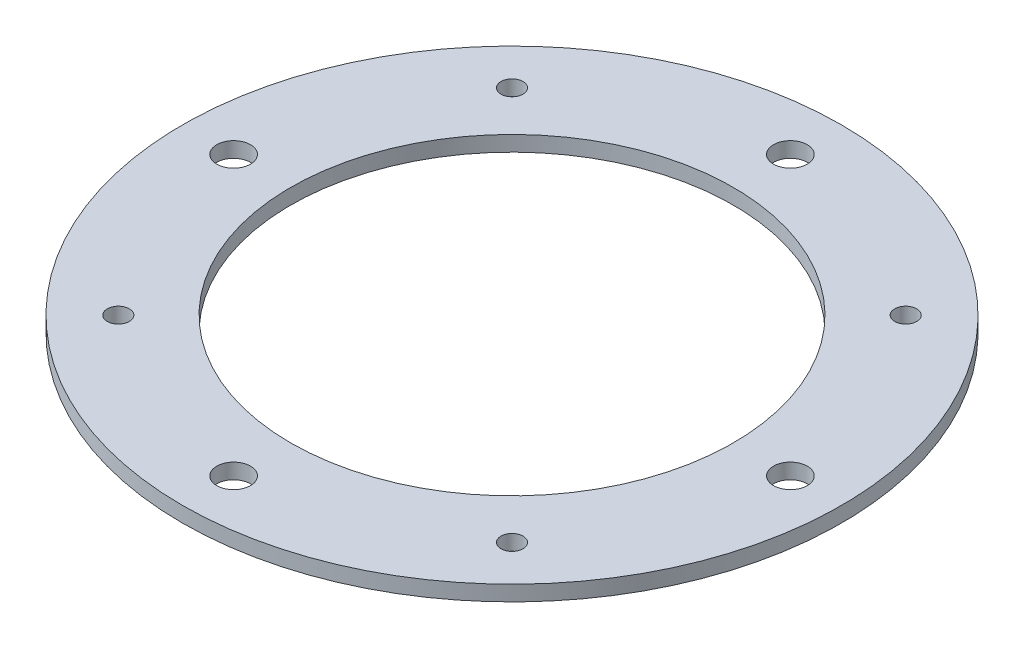
ISO-10303-21;
HEADER;
FILE_DESCRIPTION(('STEP AP214'),'2;1');
FILE_NAME('part.step','',(''),(''),'','','');
FILE_SCHEMA(('AUTOMOTIVE_DESIGN { 1 0 10303 214 1 1 1 1 }'));
ENDSEC;
DATA;
#1=APPLICATION_CONTEXT('core data for automotive mechanical design processes');
#2=APPLICATION_PROTOCOL_DEFINITION('international standard','automotive_design',2000,#1);
#3=PRODUCT_CONTEXT('',#1,'mechanical');
#4=PRODUCT('Part','Part','',(#3));
#5=PRODUCT_RELATED_PRODUCT_CATEGORY('part','',(#4));
#6=PRODUCT_DEFINITION_FORMATION('','',#4);
#7=PRODUCT_DEFINITION_CONTEXT('part definition',#1,'design');
#8=PRODUCT_DEFINITION('design','',#6,#7);
#9=PRODUCT_DEFINITION_SHAPE('','',#8);
#10=(LENGTH_UNIT() NAMED_UNIT(*) SI_UNIT(.MILLI.,.METRE.));
#11=(NAMED_UNIT(*) PLANE_ANGLE_UNIT() SI_UNIT($,.RADIAN.));
#12=(NAMED_UNIT(*) SI_UNIT($,.STERADIAN.) SOLID_ANGLE_UNIT());
#13=UNCERTAINTY_MEASURE_WITH_UNIT(LENGTH_MEASURE(1.E-05),#10,'distance_accuracy_value','');
#14=(GEOMETRIC_REPRESENTATION_CONTEXT(3) GLOBAL_UNCERTAINTY_ASSIGNED_CONTEXT((#13)) GLOBAL_UNIT_ASSIGNED_CONTEXT((#10,
#11,#12)) REPRESENTATION_CONTEXT('',''));
#15=CARTESIAN_POINT('',(0.,0.,0.));
#16=DIRECTION('',(0.,0.,1.));
#17=DIRECTION('',(1.,0.,0.));
#18=AXIS2_PLACEMENT_3D('',#15,#16,#17);
#19=CARTESIAN_POINT('',(0.,1.5,0.));
#20=DIRECTION('',(0.,-1.,0.));
#21=DIRECTION('',(0.,0.,-1.));
#22=AXIS2_PLACEMENT_3D('',#19,#20,#21);
#23=CYLINDRICAL_SURFACE('',#22,64.4);
#24=CARTESIAN_POINT('',(0.,1.5,0.));
#25=DIRECTION('',(0.,1.,0.));
#26=DIRECTION('',(0.,0.,1.));
#27=AXIS2_PLACEMENT_3D('',#24,#25,#26);
#28=CIRCLE('',#27,64.4);
#29=CARTESIAN_POINT('',(0.,1.5,64.4));
#30=VERTEX_POINT('',#29);
#31=EDGE_CURVE('E10',#30,#30,#28,.T.);
#32=ORIENTED_EDGE('',*,*,#31,.F.);
#33=EDGE_LOOP('',(#32));
#34=FACE_BOUND('',#33,.T.);
#35=CARTESIAN_POINT('',(0.,-1.5,0.));
#36=DIRECTION('',(0.,1.,0.));
#37=DIRECTION('',(0.,0.,1.));
#38=AXIS2_PLACEMENT_3D('',#35,#36,#37);
#39=CIRCLE('',#38,64.4);
#40=CARTESIAN_POINT('',(0.,-1.5,64.4));
#41=VERTEX_POINT('',#40);
#42=EDGE_CURVE('E39',#41,#41,#39,.T.);
#43=ORIENTED_EDGE('',*,*,#42,.T.);
#44=EDGE_LOOP('',(#43));
#45=FACE_BOUND('',#44,.T.);
#46=ADVANCED_FACE('F36',(#34,#45),#23,.T.);
#47=CARTESIAN_POINT('',(0.,1.5,0.));
#48=DIRECTION('',(0.,1.,0.));
#49=DIRECTION('',(0.,0.,1.));
#50=AXIS2_PLACEMENT_3D('',#47,#48,#49);
#51=PLANE('',#50);
#52=CARTESIAN_POINT('',(0.,1.5,0.));
#53=DIRECTION('',(0.,1.,0.));
#54=DIRECTION('',(0.,0.,1.));
#55=AXIS2_PLACEMENT_3D('',#52,#53,#54);
#56=CIRCLE('',#55,43.25);
#57=CARTESIAN_POINT('',(0.,1.5,43.25));
#58=VERTEX_POINT('',#57);
#59=EDGE_CURVE('E96',#58,#58,#56,.T.);
#60=ORIENTED_EDGE('',*,*,#59,.F.);
#61=EDGE_LOOP('',(#60));
#62=FACE_BOUND('',#61,.T.);
#63=CARTESIAN_POINT('',(-38.4666088965484,1.5,-38.466608896548));
#64=DIRECTION('',(0.,1.,0.));
#65=DIRECTION('',(1.,0.,0.));
#66=AXIS2_PLACEMENT_3D('',#63,#64,#65);
#67=CIRCLE('',#66,2.15);
#68=CARTESIAN_POINT('',(-36.3166088965484,1.5,-38.466608896548));
#69=VERTEX_POINT('',#68);
#70=EDGE_CURVE('E77',#69,#69,#67,.T.);
#71=ORIENTED_EDGE('',*,*,#70,.F.);
#72=EDGE_LOOP('',(#71));
#73=FACE_BOUND('',#72,.T.);
#74=CARTESIAN_POINT('',(-38.4666088965481,1.5,38.4666088965483));
#75=DIRECTION('',(0.,1.,0.));
#76=DIRECTION('',(0.,0.,-1.));
#77=AXIS2_PLACEMENT_3D('',#74,#75,#76);
#78=CIRCLE('',#77,2.15);
#79=CARTESIAN_POINT('',(-38.4666088965481,1.5,36.3166088965483));
#80=VERTEX_POINT('',#79);
#81=EDGE_CURVE('E86',#80,#80,#78,.T.);
#82=ORIENTED_EDGE('',*,*,#81,.F.);
#83=EDGE_LOOP('',(#82));
#84=FACE_BOUND('',#83,.T.);
#85=CARTESIAN_POINT('',(38.4666088965487,1.5,38.4666088965477));
#86=DIRECTION('',(0.,1.,0.));
#87=DIRECTION('',(-1.,0.,0.));
#88=AXIS2_PLACEMENT_3D('',#85,#86,#87);
#89=CIRCLE('',#88,2.15);
#90=CARTESIAN_POINT('',(36.3166088965487,1.5,38.4666088965477));
#91=VERTEX_POINT('',#90);
#92=EDGE_CURVE('E78',#91,#91,#89,.T.);
#93=ORIENTED_EDGE('',*,*,#92,.F.);
#94=EDGE_LOOP('',(#93));
#95=FACE_BOUND('',#94,.T.);
#96=CARTESIAN_POINT('',(38.4666088965481,1.5,-38.4666088965483));
#97=DIRECTION('',(0.,1.,0.));
#98=DIRECTION('',(0.,0.,1.));
#99=AXIS2_PLACEMENT_3D('',#96,#97,#98);
#100=CIRCLE('',#99,2.15);
#101=CARTESIAN_POINT('',(38.4666088965481,1.5,-36.3166088965483));
#102=VERTEX_POINT('',#101);
#103=EDGE_CURVE('E74',#102,#102,#100,.T.);
#104=ORIENTED_EDGE('',*,*,#103,.F.);
#105=EDGE_LOOP('',(#104));
#106=FACE_BOUND('',#105,.T.);
#107=CARTESIAN_POINT('',(-1.89936584833066E-13,1.5,-54.4));
#108=DIRECTION('',(0.,1.,0.));
#109=DIRECTION('',(1.,0.,0.));
#110=AXIS2_PLACEMENT_3D('',#107,#108,#109);
#111=CIRCLE('',#110,3.3);
#112=CARTESIAN_POINT('',(3.29999999999981,1.5,-54.4));
#113=VERTEX_POINT('',#112);
#114=EDGE_CURVE('E53',#113,#113,#111,.T.);
#115=ORIENTED_EDGE('',*,*,#114,.F.);
#116=EDGE_LOOP('',(#115));
#117=FACE_BOUND('',#116,.T.);
#118=CARTESIAN_POINT('',(-54.4,1.5,0.));
#119=DIRECTION('',(0.,1.,0.));
#120=DIRECTION('',(0.,0.,-1.));
#121=AXIS2_PLACEMENT_3D('',#118,#119,#120);
#122=CIRCLE('',#121,3.3);
#123=CARTESIAN_POINT('',(-54.4,1.5,-3.3));
#124=VERTEX_POINT('',#123);
#125=EDGE_CURVE('E62',#124,#124,#122,.T.);
#126=ORIENTED_EDGE('',*,*,#125,.F.);
#127=EDGE_LOOP('',(#126));
#128=FACE_BOUND('',#127,.T.);
#129=CARTESIAN_POINT('',(5.69809754499199E-13,1.5,54.4));
#130=DIRECTION('',(0.,1.,0.));
#131=DIRECTION('',(-1.,0.,0.));
#132=AXIS2_PLACEMENT_3D('',#129,#130,#131);
#133=CIRCLE('',#132,3.3);
#134=CARTESIAN_POINT('',(-3.29999999999943,1.5,54.4));
#135=VERTEX_POINT('',#134);
#136=EDGE_CURVE('E54',#135,#135,#133,.T.);
#137=ORIENTED_EDGE('',*,*,#136,.F.);
#138=EDGE_LOOP('',(#137));
#139=FACE_BOUND('',#138,.T.);
#140=CARTESIAN_POINT('',(54.4,1.5,0.));
#141=DIRECTION('',(0.,1.,0.));
#142=DIRECTION('',(0.,0.,1.));
#143=AXIS2_PLACEMENT_3D('',#140,#141,#142);
#144=CIRCLE('',#143,3.3);
#145=CARTESIAN_POINT('',(54.4,1.5,3.3));
#146=VERTEX_POINT('',#145);
#147=EDGE_CURVE('E50',#146,#146,#144,.T.);
#148=ORIENTED_EDGE('',*,*,#147,.F.);
#149=EDGE_LOOP('',(#148));
#150=FACE_BOUND('',#149,.T.);
#151=ORIENTED_EDGE('',*,*,#31,.T.);
#152=EDGE_LOOP('',(#151));
#153=FACE_BOUND('',#152,.T.);
#154=ADVANCED_FACE('F112',(#62,#73,#84,#95,#106,#117,#128,#139,#150,#153),#51,.T.);
#155=CARTESIAN_POINT('',(0.,-1.5,0.));
#156=DIRECTION('',(0.,1.,0.));
#157=DIRECTION('',(0.,0.,1.));
#158=AXIS2_PLACEMENT_3D('',#155,#156,#157);
#159=PLANE('',#158);
#160=CARTESIAN_POINT('',(0.,-1.5,0.));
#161=DIRECTION('',(0.,1.,0.));
#162=DIRECTION('',(0.,0.,1.));
#163=AXIS2_PLACEMENT_3D('',#160,#161,#162);
#164=CIRCLE('',#163,43.25);
#165=CARTESIAN_POINT('',(0.,-1.5,43.25));
#166=VERTEX_POINT('',#165);
#167=EDGE_CURVE('E85',#166,#166,#164,.T.);
#168=ORIENTED_EDGE('',*,*,#167,.T.);
#169=EDGE_LOOP('',(#168));
#170=FACE_BOUND('',#169,.T.);
#171=CARTESIAN_POINT('',(-38.4666088965484,-1.5,-38.466608896548));
#172=DIRECTION('',(0.,1.,0.));
#173=DIRECTION('',(1.,0.,0.));
#174=AXIS2_PLACEMENT_3D('',#171,#172,#173);
#175=CIRCLE('',#174,2.15);
#176=CARTESIAN_POINT('',(-36.3166088965484,-1.5,-38.466608896548));
#177=VERTEX_POINT('',#176);
#178=EDGE_CURVE('E89',#177,#177,#175,.T.);
#179=ORIENTED_EDGE('',*,*,#178,.T.);
#180=EDGE_LOOP('',(#179));
#181=FACE_BOUND('',#180,.T.);
#182=CARTESIAN_POINT('',(-38.4666088965481,-1.5,38.4666088965483));
#183=DIRECTION('',(0.,1.,0.));
#184=DIRECTION('',(0.,0.,-1.));
#185=AXIS2_PLACEMENT_3D('',#182,#183,#184);
#186=CIRCLE('',#185,2.15);
#187=CARTESIAN_POINT('',(-38.4666088965481,-1.5,36.3166088965483));
#188=VERTEX_POINT('',#187);
#189=EDGE_CURVE('E81',#188,#188,#186,.T.);
#190=ORIENTED_EDGE('',*,*,#189,.T.);
#191=EDGE_LOOP('',(#190));
#192=FACE_BOUND('',#191,.T.);
#193=CARTESIAN_POINT('',(38.4666088965487,-1.5,38.4666088965477));
#194=DIRECTION('',(0.,1.,0.));
#195=DIRECTION('',(-1.,0.,0.));
#196=AXIS2_PLACEMENT_3D('',#193,#194,#195);
#197=CIRCLE('',#196,2.15);
#198=CARTESIAN_POINT('',(36.3166088965487,-1.5,38.4666088965477));
#199=VERTEX_POINT('',#198);
#200=EDGE_CURVE('E82',#199,#199,#197,.T.);
#201=ORIENTED_EDGE('',*,*,#200,.T.);
#202=EDGE_LOOP('',(#201));
#203=FACE_BOUND('',#202,.T.);
#204=CARTESIAN_POINT('',(38.4666088965481,-1.5,-38.4666088965483));
#205=DIRECTION('',(0.,1.,0.));
#206=DIRECTION('',(0.,0.,1.));
#207=AXIS2_PLACEMENT_3D('',#204,#205,#206);
#208=CIRCLE('',#207,2.15);
#209=CARTESIAN_POINT('',(38.4666088965481,-1.5,-36.3166088965483));
#210=VERTEX_POINT('',#209);
#211=EDGE_CURVE('E61',#210,#210,#208,.T.);
#212=ORIENTED_EDGE('',*,*,#211,.T.);
#213=EDGE_LOOP('',(#212));
#214=FACE_BOUND('',#213,.T.);
#215=CARTESIAN_POINT('',(-1.89936584833066E-13,-1.5,-54.4));
#216=DIRECTION('',(0.,1.,0.));
#217=DIRECTION('',(1.,0.,0.));
#218=AXIS2_PLACEMENT_3D('',#215,#216,#217);
#219=CIRCLE('',#218,3.3);
#220=CARTESIAN_POINT('',(3.29999999999981,-1.5,-54.4));
#221=VERTEX_POINT('',#220);
#222=EDGE_CURVE('E65',#221,#221,#219,.T.);
#223=ORIENTED_EDGE('',*,*,#222,.T.);
#224=EDGE_LOOP('',(#223));
#225=FACE_BOUND('',#224,.T.);
#226=CARTESIAN_POINT('',(-54.4,-1.5,0.));
#227=DIRECTION('',(0.,1.,0.));
#228=DIRECTION('',(0.,0.,-1.));
#229=AXIS2_PLACEMENT_3D('',#226,#227,#228);
#230=CIRCLE('',#229,3.3);
#231=CARTESIAN_POINT('',(-54.4,-1.5,-3.3));
#232=VERTEX_POINT('',#231);
#233=EDGE_CURVE('E57',#232,#232,#230,.T.);
#234=ORIENTED_EDGE('',*,*,#233,.T.);
#235=EDGE_LOOP('',(#234));
#236=FACE_BOUND('',#235,.T.);
#237=CARTESIAN_POINT('',(5.69809754499199E-13,-1.5,54.4));
#238=DIRECTION('',(0.,1.,0.));
#239=DIRECTION('',(-1.,0.,0.));
#240=AXIS2_PLACEMENT_3D('',#237,#238,#239);
#241=CIRCLE('',#240,3.3);
#242=CARTESIAN_POINT('',(-3.29999999999943,-1.5,54.4));
#243=VERTEX_POINT('',#242);
#244=EDGE_CURVE('E58',#243,#243,#241,.T.);
#245=ORIENTED_EDGE('',*,*,#244,.T.);
#246=EDGE_LOOP('',(#245));
#247=FACE_BOUND('',#246,.T.);
#248=CARTESIAN_POINT('',(54.4,-1.5,0.));
#249=DIRECTION('',(0.,1.,0.));
#250=DIRECTION('',(0.,0.,1.));
#251=AXIS2_PLACEMENT_3D('',#248,#249,#250);
#252=CIRCLE('',#251,3.3);
#253=CARTESIAN_POINT('',(54.4,-1.5,3.3));
#254=VERTEX_POINT('',#253);
#255=EDGE_CURVE('E46',#254,#254,#252,.T.);
#256=ORIENTED_EDGE('',*,*,#255,.T.);
#257=EDGE_LOOP('',(#256));
#258=FACE_BOUND('',#257,.T.);
#259=ORIENTED_EDGE('',*,*,#42,.F.);
#260=EDGE_LOOP('',(#259));
#261=FACE_BOUND('',#260,.T.);
#262=ADVANCED_FACE('F102',(#170,#181,#192,#203,#214,#225,#236,#247,#258,#261),#159,.F.);
#263=CARTESIAN_POINT('',(54.4,1.5,0.));
#264=DIRECTION('',(0.,1.,0.));
#265=DIRECTION('',(0.,0.,1.));
#266=AXIS2_PLACEMENT_3D('',#263,#264,#265);
#267=CYLINDRICAL_SURFACE('',#266,3.3);
#268=ORIENTED_EDGE('',*,*,#255,.F.);
#269=EDGE_LOOP('',(#268));
#270=FACE_BOUND('',#269,.T.);
#271=ORIENTED_EDGE('',*,*,#147,.T.);
#272=EDGE_LOOP('',(#271));
#273=FACE_BOUND('',#272,.T.);
#274=ADVANCED_FACE('F132',(#270,#273),#267,.F.);
#275=CARTESIAN_POINT('',(5.69809754499199E-13,1.5,54.4));
#276=DIRECTION('',(0.,1.,0.));
#277=DIRECTION('',(-1.,0.,0.));
#278=AXIS2_PLACEMENT_3D('',#275,#276,#277);
#279=CYLINDRICAL_SURFACE('',#278,3.3);
#280=ORIENTED_EDGE('',*,*,#244,.F.);
#281=EDGE_LOOP('',(#280));
#282=FACE_BOUND('',#281,.T.);
#283=ORIENTED_EDGE('',*,*,#136,.T.);
#284=EDGE_LOOP('',(#283));
#285=FACE_BOUND('',#284,.T.);
#286=ADVANCED_FACE('F134',(#282,#285),#279,.F.);
#287=CARTESIAN_POINT('',(-54.4,1.5,0.));
#288=DIRECTION('',(0.,1.,0.));
#289=DIRECTION('',(0.,0.,-1.));
#290=AXIS2_PLACEMENT_3D('',#287,#288,#289);
#291=CYLINDRICAL_SURFACE('',#290,3.3);
#292=ORIENTED_EDGE('',*,*,#233,.F.);
#293=EDGE_LOOP('',(#292));
#294=FACE_BOUND('',#293,.T.);
#295=ORIENTED_EDGE('',*,*,#125,.T.);
#296=EDGE_LOOP('',(#295));
#297=FACE_BOUND('',#296,.T.);
#298=ADVANCED_FACE('F141',(#294,#297),#291,.F.);
#299=CARTESIAN_POINT('',(-1.89936584833066E-13,1.5,-54.4));
#300=DIRECTION('',(0.,1.,0.));
#301=DIRECTION('',(1.,0.,0.));
#302=AXIS2_PLACEMENT_3D('',#299,#300,#301);
#303=CYLINDRICAL_SURFACE('',#302,3.3);
#304=ORIENTED_EDGE('',*,*,#222,.F.);
#305=EDGE_LOOP('',(#304));
#306=FACE_BOUND('',#305,.T.);
#307=ORIENTED_EDGE('',*,*,#114,.T.);
#308=EDGE_LOOP('',(#307));
#309=FACE_BOUND('',#308,.T.);
#310=ADVANCED_FACE('F204',(#306,#309),#303,.F.);
#311=CARTESIAN_POINT('',(38.4666088965481,1.5,-38.4666088965483));
#312=DIRECTION('',(0.,1.,0.));
#313=DIRECTION('',(0.,0.,1.));
#314=AXIS2_PLACEMENT_3D('',#311,#312,#313);
#315=CYLINDRICAL_SURFACE('',#314,2.15);
#316=ORIENTED_EDGE('',*,*,#211,.F.);
#317=EDGE_LOOP('',(#316));
#318=FACE_BOUND('',#317,.T.);
#319=ORIENTED_EDGE('',*,*,#103,.T.);
#320=EDGE_LOOP('',(#319));
#321=FACE_BOUND('',#320,.T.);
#322=ADVANCED_FACE('F196',(#318,#321),#315,.F.);
#323=CARTESIAN_POINT('',(38.4666088965487,1.5,38.4666088965477));
#324=DIRECTION('',(0.,1.,0.));
#325=DIRECTION('',(-1.,0.,0.));
#326=AXIS2_PLACEMENT_3D('',#323,#324,#325);
#327=CYLINDRICAL_SURFACE('',#326,2.15);
#328=ORIENTED_EDGE('',*,*,#200,.F.);
#329=EDGE_LOOP('',(#328));
#330=FACE_BOUND('',#329,.T.);
#331=ORIENTED_EDGE('',*,*,#92,.T.);
#332=EDGE_LOOP('',(#331));
#333=FACE_BOUND('',#332,.T.);
#334=ADVANCED_FACE('F188',(#330,#333),#327,.F.);
#335=CARTESIAN_POINT('',(-38.4666088965481,1.5,38.4666088965483));
#336=DIRECTION('',(0.,1.,0.));
#337=DIRECTION('',(0.,0.,-1.));
#338=AXIS2_PLACEMENT_3D('',#335,#336,#337);
#339=CYLINDRICAL_SURFACE('',#338,2.15);
#340=ORIENTED_EDGE('',*,*,#189,.F.);
#341=EDGE_LOOP('',(#340));
#342=FACE_BOUND('',#341,.T.);
#343=ORIENTED_EDGE('',*,*,#81,.T.);
#344=EDGE_LOOP('',(#343));
#345=FACE_BOUND('',#344,.T.);
#346=ADVANCED_FACE('F181',(#342,#345),#339,.F.);
#347=CARTESIAN_POINT('',(-38.4666088965484,1.5,-38.466608896548));
#348=DIRECTION('',(0.,1.,0.));
#349=DIRECTION('',(1.,0.,0.));
#350=AXIS2_PLACEMENT_3D('',#347,#348,#349);
#351=CYLINDRICAL_SURFACE('',#350,2.15);
#352=ORIENTED_EDGE('',*,*,#178,.F.);
#353=EDGE_LOOP('',(#352));
#354=FACE_BOUND('',#353,.T.);
#355=ORIENTED_EDGE('',*,*,#70,.T.);
#356=EDGE_LOOP('',(#355));
#357=FACE_BOUND('',#356,.T.);
#358=ADVANCED_FACE('F108',(#354,#357),#351,.F.);
#359=CARTESIAN_POINT('',(0.,-1.5,0.));
#360=DIRECTION('',(0.,1.,0.));
#361=DIRECTION('',(0.,0.,1.));
#362=AXIS2_PLACEMENT_3D('',#359,#360,#361);
#363=CYLINDRICAL_SURFACE('',#362,43.25);
#364=ORIENTED_EDGE('',*,*,#167,.F.);
#365=EDGE_LOOP('',(#364));
#366=FACE_BOUND('',#365,.T.);
#367=ORIENTED_EDGE('',*,*,#59,.T.);
#368=EDGE_LOOP('',(#367));
#369=FACE_BOUND('',#368,.T.);
#370=ADVANCED_FACE('F105',(#366,#369),#363,.F.);
#371=CLOSED_SHELL('',(#46,#154,#262,#274,#286,#298,#310,#322,#334,#346,#358,#370));
#372=MANIFOLD_SOLID_BREP('B2',#371);
#373=ADVANCED_BREP_SHAPE_REPRESENTATION('',(#18,#372),#14);
#374=SHAPE_DEFINITION_REPRESENTATION(#9,#373);
ENDSEC;
END-ISO-10303-21;
